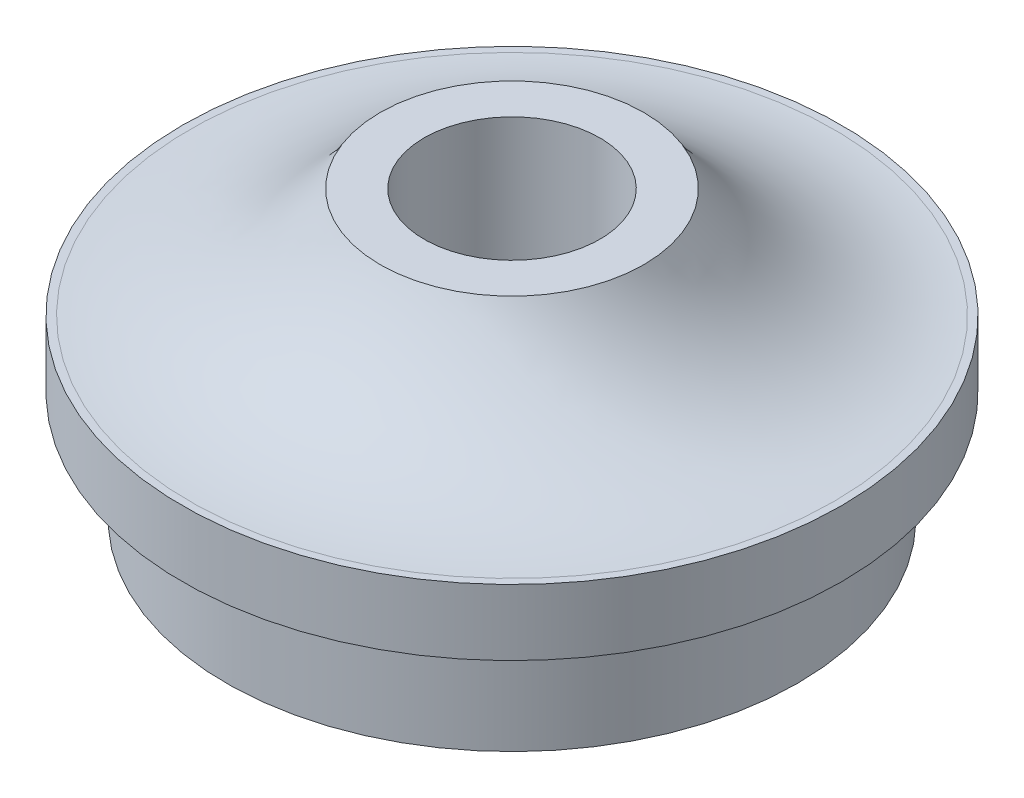
ISO-10303-21;
HEADER;
FILE_DESCRIPTION(('STEP AP214'),'2;1');
FILE_NAME('part.step','',(''),(''),'','','');
FILE_SCHEMA(('AUTOMOTIVE_DESIGN { 1 0 10303 214 1 1 1 1 }'));
ENDSEC;
DATA;
#1=APPLICATION_CONTEXT('core data for automotive mechanical design processes');
#2=APPLICATION_PROTOCOL_DEFINITION('international standard','automotive_design',2000,#1);
#3=PRODUCT_CONTEXT('',#1,'mechanical');
#4=PRODUCT('Part','Part','',(#3));
#5=PRODUCT_RELATED_PRODUCT_CATEGORY('part','',(#4));
#6=PRODUCT_DEFINITION_FORMATION('','',#4);
#7=PRODUCT_DEFINITION_CONTEXT('part definition',#1,'design');
#8=PRODUCT_DEFINITION('design','',#6,#7);
#9=PRODUCT_DEFINITION_SHAPE('','',#8);
#10=(LENGTH_UNIT() NAMED_UNIT(*) SI_UNIT(.MILLI.,.METRE.));
#11=(NAMED_UNIT(*) PLANE_ANGLE_UNIT() SI_UNIT($,.RADIAN.));
#12=(NAMED_UNIT(*) SI_UNIT($,.STERADIAN.) SOLID_ANGLE_UNIT());
#13=UNCERTAINTY_MEASURE_WITH_UNIT(LENGTH_MEASURE(1.E-05),#10,'distance_accuracy_value','');
#14=(GEOMETRIC_REPRESENTATION_CONTEXT(3) GLOBAL_UNCERTAINTY_ASSIGNED_CONTEXT((#13)) GLOBAL_UNIT_ASSIGNED_CONTEXT((#10,
#11,#12)) REPRESENTATION_CONTEXT('',''));
#15=CARTESIAN_POINT('',(0.,0.,0.));
#16=DIRECTION('',(0.,0.,1.));
#17=DIRECTION('',(1.,0.,0.));
#18=AXIS2_PLACEMENT_3D('',#15,#16,#17);
#19=CARTESIAN_POINT('',(0.,0.,0.));
#20=DIRECTION('',(0.,1.,0.));
#21=DIRECTION('',(-1.,0.,0.));
#22=AXIS2_PLACEMENT_3D('',#19,#20,#21);
#23=PLANE('',#22);
#24=CARTESIAN_POINT('',(0.,0.,0.));
#25=DIRECTION('',(0.,1.,0.));
#26=DIRECTION('',(-1.,0.,0.));
#27=AXIS2_PLACEMENT_3D('',#24,#25,#26);
#28=CIRCLE('',#27,4.);
#29=CARTESIAN_POINT('',(-4.,0.,0.));
#30=VERTEX_POINT('',#29);
#31=EDGE_CURVE('E65',#30,#30,#28,.T.);
#32=ORIENTED_EDGE('',*,*,#31,.T.);
#33=EDGE_LOOP('',(#32));
#34=FACE_BOUND('',#33,.T.);
#35=CARTESIAN_POINT('',(0.,0.,0.));
#36=DIRECTION('',(0.,-1.,0.));
#37=DIRECTION('',(1.,0.,0.));
#38=AXIS2_PLACEMENT_3D('',#35,#36,#37);
#39=CIRCLE('',#38,13.);
#40=CARTESIAN_POINT('',(13.,1.00104388216773E-13,0.));
#41=VERTEX_POINT('',#40);
#42=EDGE_CURVE('E46',#41,#41,#39,.T.);
#43=ORIENTED_EDGE('',*,*,#42,.T.);
#44=EDGE_LOOP('',(#43));
#45=FACE_BOUND('',#44,.T.);
#46=ADVANCED_FACE('F39',(#34,#45),#23,.F.);
#47=CARTESIAN_POINT('',(9.19013397232656E-13,-267.914485954569,0.));
#48=DIRECTION('',(0.,-1.,0.));
#49=DIRECTION('',(1.,0.,0.));
#50=AXIS2_PLACEMENT_3D('',#47,#48,#49);
#51=CYLINDRICAL_SURFACE('',#50,13.);
#52=ORIENTED_EDGE('',*,*,#42,.F.);
#53=EDGE_LOOP('',(#52));
#54=FACE_BOUND('',#53,.T.);
#55=CARTESIAN_POINT('',(0.,5.00000000000006,0.));
#56=DIRECTION('',(0.,-1.,0.));
#57=DIRECTION('',(1.,0.,0.));
#58=AXIS2_PLACEMENT_3D('',#55,#56,#57);
#59=CIRCLE('',#58,13.);
#60=CARTESIAN_POINT('',(13.,5.0000000000001,0.));
#61=VERTEX_POINT('',#60);
#62=EDGE_CURVE('E50',#61,#61,#59,.T.);
#63=ORIENTED_EDGE('',*,*,#62,.T.);
#64=EDGE_LOOP('',(#63));
#65=FACE_BOUND('',#64,.T.);
#66=ADVANCED_FACE('F89',(#54,#65),#51,.T.);
#67=CARTESIAN_POINT('',(-13.,5.,0.));
#68=DIRECTION('',(0.,1.,0.));
#69=DIRECTION('',(-1.,0.,0.));
#70=AXIS2_PLACEMENT_3D('',#67,#68,#69);
#71=PLANE('',#70);
#72=ORIENTED_EDGE('',*,*,#62,.F.);
#73=EDGE_LOOP('',(#72));
#74=FACE_BOUND('',#73,.T.);
#75=CARTESIAN_POINT('',(0.,5.00000000000006,0.));
#76=DIRECTION('',(0.,-1.,0.));
#77=DIRECTION('',(1.,0.,0.));
#78=AXIS2_PLACEMENT_3D('',#75,#76,#77);
#79=CIRCLE('',#78,15.);
#80=CARTESIAN_POINT('',(15.,5.00000000000011,0.));
#81=VERTEX_POINT('',#80);
#82=EDGE_CURVE('E54',#81,#81,#79,.T.);
#83=ORIENTED_EDGE('',*,*,#82,.T.);
#84=EDGE_LOOP('',(#83));
#85=FACE_BOUND('',#84,.T.);
#86=ADVANCED_FACE('F94',(#74,#85),#71,.F.);
#87=CARTESIAN_POINT('',(9.19013397232656E-13,-267.914485954569,0.));
#88=DIRECTION('',(0.,-1.,0.));
#89=DIRECTION('',(1.,0.,0.));
#90=AXIS2_PLACEMENT_3D('',#87,#88,#89);
#91=CYLINDRICAL_SURFACE('',#90,15.);
#92=ORIENTED_EDGE('',*,*,#82,.F.);
#93=EDGE_LOOP('',(#92));
#94=FACE_BOUND('',#93,.T.);
#95=CARTESIAN_POINT('',(0.,8.00000000000006,0.));
#96=DIRECTION('',(0.,-1.,0.));
#97=DIRECTION('',(1.,0.,0.));
#98=AXIS2_PLACEMENT_3D('',#95,#96,#97);
#99=CIRCLE('',#98,15.);
#100=CARTESIAN_POINT('',(14.9999999999999,8.00000000000012,0.));
#101=VERTEX_POINT('',#100);
#102=EDGE_CURVE('E59',#101,#101,#99,.T.);
#103=ORIENTED_EDGE('',*,*,#102,.T.);
#104=EDGE_LOOP('',(#103));
#105=FACE_BOUND('',#104,.T.);
#106=ADVANCED_FACE('F100',(#94,#105),#91,.T.);
#107=CARTESIAN_POINT('',(-15.,7.99999999999997,0.));
#108=DIRECTION('',(0.,-1.,0.));
#109=DIRECTION('',(1.,0.,0.));
#110=AXIS2_PLACEMENT_3D('',#107,#108,#109);
#111=PLANE('',#110);
#112=CARTESIAN_POINT('',(0.,8.00000000000002,0.));
#113=DIRECTION('',(0.,-1.,0.));
#114=DIRECTION('',(1.,0.,0.));
#115=AXIS2_PLACEMENT_3D('',#112,#113,#114);
#116=CIRCLE('',#115,14.6602540378444);
#117=CARTESIAN_POINT('',(14.6602540378444,8.00000000000007,0.));
#118=VERTEX_POINT('',#117);
#119=EDGE_CURVE('E10',#118,#118,#116,.T.);
#120=ORIENTED_EDGE('',*,*,#119,.T.);
#121=EDGE_LOOP('',(#120));
#122=FACE_BOUND('',#121,.T.);
#123=ORIENTED_EDGE('',*,*,#102,.F.);
#124=EDGE_LOOP('',(#123));
#125=FACE_BOUND('',#124,.T.);
#126=ADVANCED_FACE('F78',(#122,#125),#111,.F.);
#127=CARTESIAN_POINT('',(0.,13.,0.));
#128=DIRECTION('',(0.,1.,0.));
#129=DIRECTION('',(-1.,0.,0.));
#130=AXIS2_PLACEMENT_3D('',#127,#128,#129);
#131=PLANE('',#130);
#132=CARTESIAN_POINT('',(0.,13.,0.));
#133=DIRECTION('',(0.,1.,0.));
#134=DIRECTION('',(-1.,0.,0.));
#135=AXIS2_PLACEMENT_3D('',#132,#133,#134);
#136=CIRCLE('',#135,4.);
#137=CARTESIAN_POINT('',(-4.00000000000004,13.,0.));
#138=VERTEX_POINT('',#137);
#139=EDGE_CURVE('E68',#138,#138,#136,.T.);
#140=ORIENTED_EDGE('',*,*,#139,.F.);
#141=EDGE_LOOP('',(#140));
#142=FACE_BOUND('',#141,.T.);
#143=CARTESIAN_POINT('',(0.,13.,0.));
#144=DIRECTION('',(0.,1.,0.));
#145=DIRECTION('',(-1.,0.,0.));
#146=AXIS2_PLACEMENT_3D('',#143,#144,#145);
#147=CIRCLE('',#146,6.);
#148=CARTESIAN_POINT('',(-6.00000000000005,13.,0.));
#149=VERTEX_POINT('',#148);
#150=EDGE_CURVE('E62',#149,#149,#147,.T.);
#151=ORIENTED_EDGE('',*,*,#150,.T.);
#152=EDGE_LOOP('',(#151));
#153=FACE_BOUND('',#152,.T.);
#154=ADVANCED_FACE('F75',(#142,#153),#131,.T.);
#155=CARTESIAN_POINT('',(0.,18.,0.));
#156=DIRECTION('',(0.,-1.,0.));
#157=DIRECTION('',(1.,0.,0.));
#158=AXIS2_PLACEMENT_3D('',#155,#156,#157);
#159=TOROIDAL_SURFACE('',#158,14.6602540378444,10.);
#160=ORIENTED_EDGE('',*,*,#119,.F.);
#161=EDGE_LOOP('',(#160));
#162=FACE_BOUND('',#161,.T.);
#163=ORIENTED_EDGE('',*,*,#150,.F.);
#164=EDGE_LOOP('',(#163));
#165=FACE_BOUND('',#164,.T.);
#166=ADVANCED_FACE('F41',(#162,#165),#159,.F.);
#167=CARTESIAN_POINT('',(0.,-4.99999999999998,0.));
#168=DIRECTION('',(0.,1.,0.));
#169=DIRECTION('',(-1.,0.,0.));
#170=AXIS2_PLACEMENT_3D('',#167,#168,#169);
#171=CYLINDRICAL_SURFACE('',#170,4.);
#172=ORIENTED_EDGE('',*,*,#139,.T.);
#173=EDGE_LOOP('',(#172));
#174=FACE_BOUND('',#173,.T.);
#175=ORIENTED_EDGE('',*,*,#31,.F.);
#176=EDGE_LOOP('',(#175));
#177=FACE_BOUND('',#176,.T.);
#178=ADVANCED_FACE('F72',(#174,#177),#171,.F.);
#179=CLOSED_SHELL('',(#46,#66,#86,#106,#126,#154,#166,#178));
#180=MANIFOLD_SOLID_BREP('B2',#179);
#181=ADVANCED_BREP_SHAPE_REPRESENTATION('',(#18,#180),#14);
#182=SHAPE_DEFINITION_REPRESENTATION(#9,#181);
ENDSEC;
END-ISO-10303-21;
